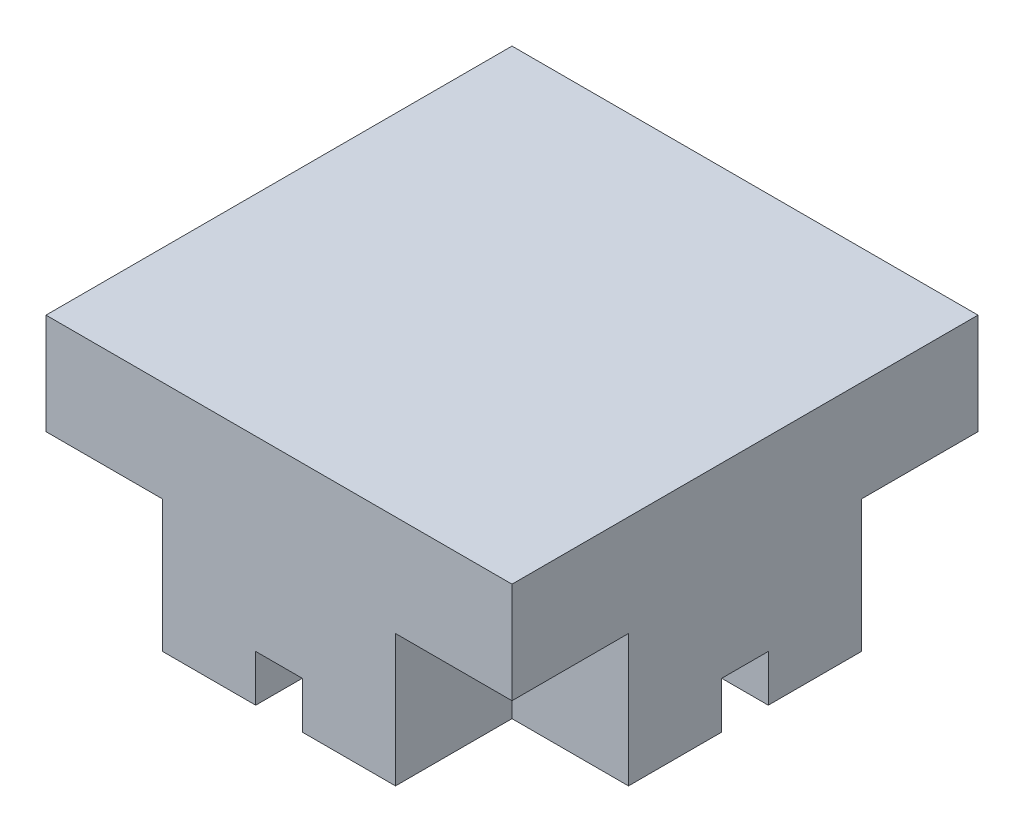
ISO-10303-21;
HEADER;
FILE_DESCRIPTION(('STEP AP214'),'2;1');
FILE_NAME('part.step','',(''),(''),'','','');
FILE_SCHEMA(('AUTOMOTIVE_DESIGN { 1 0 10303 214 1 1 1 1 }'));
ENDSEC;
DATA;
#1=APPLICATION_CONTEXT('core data for automotive mechanical design processes');
#2=APPLICATION_PROTOCOL_DEFINITION('international standard','automotive_design',2000,#1);
#3=PRODUCT_CONTEXT('',#1,'mechanical');
#4=PRODUCT('Part','Part','',(#3));
#5=PRODUCT_RELATED_PRODUCT_CATEGORY('part','',(#4));
#6=PRODUCT_DEFINITION_FORMATION('','',#4);
#7=PRODUCT_DEFINITION_CONTEXT('part definition',#1,'design');
#8=PRODUCT_DEFINITION('design','',#6,#7);
#9=PRODUCT_DEFINITION_SHAPE('','',#8);
#10=(LENGTH_UNIT() NAMED_UNIT(*) SI_UNIT(.MILLI.,.METRE.));
#11=(NAMED_UNIT(*) PLANE_ANGLE_UNIT() SI_UNIT($,.RADIAN.));
#12=(NAMED_UNIT(*) SI_UNIT($,.STERADIAN.) SOLID_ANGLE_UNIT());
#13=UNCERTAINTY_MEASURE_WITH_UNIT(LENGTH_MEASURE(1.E-05),#10,'distance_accuracy_value','');
#14=(GEOMETRIC_REPRESENTATION_CONTEXT(3) GLOBAL_UNCERTAINTY_ASSIGNED_CONTEXT((#13)) GLOBAL_UNIT_ASSIGNED_CONTEXT((#10,
#11,#12)) REPRESENTATION_CONTEXT('',''));
#15=CARTESIAN_POINT('',(0.,0.,0.));
#16=DIRECTION('',(0.,0.,1.));
#17=DIRECTION('',(1.,0.,0.));
#18=AXIS2_PLACEMENT_3D('',#15,#16,#17);
#19=CARTESIAN_POINT('',(1500.,1500.,1500.));
#20=DIRECTION('',(-1.,0.,0.));
#21=DIRECTION('',(0.,0.,1.));
#22=AXIS2_PLACEMENT_3D('',#19,#20,#21);
#23=PLANE('',#22);
#24=DIRECTION('',(0.,0.,1.));
#25=VECTOR('',#24,1.);
#26=CARTESIAN_POINT('',(1500.,300.,150.));
#27=LINE('',#26,#25);
#28=CARTESIAN_POINT('',(1500.,300.,-150.));
#29=VERTEX_POINT('',#28);
#30=CARTESIAN_POINT('',(1500.,300.,150.));
#31=VERTEX_POINT('',#30);
#32=EDGE_CURVE('E316',#29,#31,#27,.T.);
#33=ORIENTED_EDGE('',*,*,#32,.F.);
#34=DIRECTION('',(0.,-1.,0.));
#35=VECTOR('',#34,1.);
#36=CARTESIAN_POINT('',(1500.,300.,-150.));
#37=LINE('',#36,#35);
#38=CARTESIAN_POINT('',(1500.,0.,-150.));
#39=VERTEX_POINT('',#38);
#40=EDGE_CURVE('E334',#29,#39,#37,.T.);
#41=ORIENTED_EDGE('',*,*,#40,.T.);
#42=DIRECTION('',(0.,0.,-1.));
#43=VECTOR('',#42,1.);
#44=CARTESIAN_POINT('',(1500.,0.,1500.));
#45=LINE('',#44,#43);
#46=CARTESIAN_POINT('',(1500.,0.,-750.));
#47=VERTEX_POINT('',#46);
#48=EDGE_CURVE('E411',#39,#47,#45,.T.);
#49=ORIENTED_EDGE('',*,*,#48,.T.);
#50=DIRECTION('',(0.,-1.,0.));
#51=VECTOR('',#50,1.);
#52=CARTESIAN_POINT('',(1500.,850.,-750.));
#53=LINE('',#52,#51);
#54=CARTESIAN_POINT('',(1500.,850.,-750.));
#55=VERTEX_POINT('',#54);
#56=EDGE_CURVE('E661',#55,#47,#53,.T.);
#57=ORIENTED_EDGE('',*,*,#56,.F.);
#58=DIRECTION('',(0.,0.,1.));
#59=VECTOR('',#58,1.);
#60=CARTESIAN_POINT('',(1500.,850.,-1500.));
#61=LINE('',#60,#59);
#62=CARTESIAN_POINT('',(1500.,850.,-1500.));
#63=VERTEX_POINT('',#62);
#64=EDGE_CURVE('E750',#63,#55,#61,.T.);
#65=ORIENTED_EDGE('',*,*,#64,.F.);
#66=DIRECTION('',(0.,-1.,0.));
#67=VECTOR('',#66,1.);
#68=CARTESIAN_POINT('',(1500.,1500.,-1500.));
#69=LINE('',#68,#67);
#70=CARTESIAN_POINT('',(1500.,1500.,-1500.));
#71=VERTEX_POINT('',#70);
#72=EDGE_CURVE('E12',#71,#63,#69,.T.);
#73=ORIENTED_EDGE('',*,*,#72,.F.);
#74=DIRECTION('',(0.,0.,-1.));
#75=VECTOR('',#74,1.);
#76=CARTESIAN_POINT('',(1500.,1500.,1500.));
#77=LINE('',#76,#75);
#78=CARTESIAN_POINT('',(1500.,1500.,1500.));
#79=VERTEX_POINT('',#78);
#80=EDGE_CURVE('E482',#79,#71,#77,.T.);
#81=ORIENTED_EDGE('',*,*,#80,.F.);
#82=DIRECTION('',(0.,-1.,0.));
#83=VECTOR('',#82,1.);
#84=CARTESIAN_POINT('',(1500.,1500.,1500.));
#85=LINE('',#84,#83);
#86=CARTESIAN_POINT('',(1500.,850.,1500.));
#87=VERTEX_POINT('',#86);
#88=EDGE_CURVE('E469',#79,#87,#85,.T.);
#89=ORIENTED_EDGE('',*,*,#88,.T.);
#90=DIRECTION('',(0.,0.,1.));
#91=VECTOR('',#90,1.);
#92=CARTESIAN_POINT('',(1500.,850.,1500.));
#93=LINE('',#92,#91);
#94=CARTESIAN_POINT('',(1500.,850.,750.));
#95=VERTEX_POINT('',#94);
#96=EDGE_CURVE('E384',#95,#87,#93,.T.);
#97=ORIENTED_EDGE('',*,*,#96,.F.);
#98=DIRECTION('',(0.,-1.,0.));
#99=VECTOR('',#98,1.);
#100=CARTESIAN_POINT('',(1500.,850.,750.));
#101=LINE('',#100,#99);
#102=CARTESIAN_POINT('',(1500.,0.,750.));
#103=VERTEX_POINT('',#102);
#104=EDGE_CURVE('E388',#95,#103,#101,.T.);
#105=ORIENTED_EDGE('',*,*,#104,.T.);
#106=CARTESIAN_POINT('',(1500.,0.,150.));
#107=VERTEX_POINT('',#106);
#108=EDGE_CURVE('E404',#103,#107,#45,.T.);
#109=ORIENTED_EDGE('',*,*,#108,.T.);
#110=DIRECTION('',(0.,-1.,0.));
#111=VECTOR('',#110,1.);
#112=CARTESIAN_POINT('',(1500.,300.,150.));
#113=LINE('',#112,#111);
#114=EDGE_CURVE('E364',#31,#107,#113,.T.);
#115=ORIENTED_EDGE('',*,*,#114,.F.);
#116=EDGE_LOOP('',(#33,#41,#49,#57,#65,#73,#81,#89,#97,#105,#109,#115));
#117=FACE_BOUND('',#116,.T.);
#118=ADVANCED_FACE('F41',(#117),#23,.F.);
#119=CARTESIAN_POINT('',(-1500.,1500.,-1500.));
#120=DIRECTION('',(0.,0.,1.));
#121=DIRECTION('',(1.,0.,0.));
#122=AXIS2_PLACEMENT_3D('',#119,#120,#121);
#123=PLANE('',#122);
#124=DIRECTION('',(-1.,0.,0.));
#125=VECTOR('',#124,1.);
#126=CARTESIAN_POINT('',(-1500.,0.,-1500.));
#127=LINE('',#126,#125);
#128=CARTESIAN_POINT('',(750.,0.,-1500.));
#129=VERTEX_POINT('',#128);
#130=CARTESIAN_POINT('',(150.,0.,-1500.));
#131=VERTEX_POINT('',#130);
#132=EDGE_CURVE('E415',#129,#131,#127,.T.);
#133=ORIENTED_EDGE('',*,*,#132,.T.);
#134=DIRECTION('',(0.,-1.,0.));
#135=VECTOR('',#134,1.);
#136=CARTESIAN_POINT('',(150.,300.,-1500.));
#137=LINE('',#136,#135);
#138=CARTESIAN_POINT('',(150.,300.,-1500.));
#139=VERTEX_POINT('',#138);
#140=EDGE_CURVE('E370',#139,#131,#137,.T.);
#141=ORIENTED_EDGE('',*,*,#140,.F.);
#142=DIRECTION('',(1.,0.,0.));
#143=VECTOR('',#142,1.);
#144=CARTESIAN_POINT('',(150.,300.,-1500.));
#145=LINE('',#144,#143);
#146=CARTESIAN_POINT('',(-150.,300.,-1500.));
#147=VERTEX_POINT('',#146);
#148=EDGE_CURVE('E681',#147,#139,#145,.T.);
#149=ORIENTED_EDGE('',*,*,#148,.F.);
#150=DIRECTION('',(0.,-1.,0.));
#151=VECTOR('',#150,1.);
#152=CARTESIAN_POINT('',(-150.,300.,-1500.));
#153=LINE('',#152,#151);
#154=CARTESIAN_POINT('',(-150.,0.,-1500.));
#155=VERTEX_POINT('',#154);
#156=EDGE_CURVE('E807',#147,#155,#153,.T.);
#157=ORIENTED_EDGE('',*,*,#156,.T.);
#158=CARTESIAN_POINT('',(-750.,0.,-1500.));
#159=VERTEX_POINT('',#158);
#160=EDGE_CURVE('E410',#155,#159,#127,.T.);
#161=ORIENTED_EDGE('',*,*,#160,.T.);
#162=DIRECTION('',(0.,-1.,0.));
#163=VECTOR('',#162,1.);
#164=CARTESIAN_POINT('',(-750.,850.,-1500.));
#165=LINE('',#164,#163);
#166=CARTESIAN_POINT('',(-750.,850.,-1500.));
#167=VERTEX_POINT('',#166);
#168=EDGE_CURVE('E437',#167,#159,#165,.T.);
#169=ORIENTED_EDGE('',*,*,#168,.F.);
#170=DIRECTION('',(1.,0.,0.));
#171=VECTOR('',#170,1.);
#172=CARTESIAN_POINT('',(-1500.,850.,-1500.));
#173=LINE('',#172,#171);
#174=CARTESIAN_POINT('',(-1500.,850.,-1500.));
#175=VERTEX_POINT('',#174);
#176=EDGE_CURVE('E715',#175,#167,#173,.T.);
#177=ORIENTED_EDGE('',*,*,#176,.F.);
#178=DIRECTION('',(0.,-1.,0.));
#179=VECTOR('',#178,1.);
#180=CARTESIAN_POINT('',(-1500.,1500.,-1500.));
#181=LINE('',#180,#179);
#182=CARTESIAN_POINT('',(-1500.,1500.,-1500.));
#183=VERTEX_POINT('',#182);
#184=EDGE_CURVE('E50',#183,#175,#181,.T.);
#185=ORIENTED_EDGE('',*,*,#184,.F.);
#186=DIRECTION('',(-1.,0.,0.));
#187=VECTOR('',#186,1.);
#188=CARTESIAN_POINT('',(-1500.,1500.,-1500.));
#189=LINE('',#188,#187);
#190=EDGE_CURVE('E477',#71,#183,#189,.T.);
#191=ORIENTED_EDGE('',*,*,#190,.F.);
#192=ORIENTED_EDGE('',*,*,#72,.T.);
#193=DIRECTION('',(1.,0.,0.));
#194=VECTOR('',#193,1.);
#195=CARTESIAN_POINT('',(1500.,850.,-1500.));
#196=LINE('',#195,#194);
#197=CARTESIAN_POINT('',(750.,850.,-1500.));
#198=VERTEX_POINT('',#197);
#199=EDGE_CURVE('E654',#198,#63,#196,.T.);
#200=ORIENTED_EDGE('',*,*,#199,.F.);
#201=DIRECTION('',(0.,-1.,0.));
#202=VECTOR('',#201,1.);
#203=CARTESIAN_POINT('',(750.,850.,-1500.));
#204=LINE('',#203,#202);
#205=EDGE_CURVE('E759',#198,#129,#204,.T.);
#206=ORIENTED_EDGE('',*,*,#205,.T.);
#207=EDGE_LOOP('',(#133,#141,#149,#157,#161,#169,#177,#185,#191,#192,#200,#206));
#208=FACE_BOUND('',#207,.T.);
#209=ADVANCED_FACE('F736',(#208),#123,.F.);
#210=CARTESIAN_POINT('',(-1500.,1500.,1500.));
#211=DIRECTION('',(1.,0.,0.));
#212=DIRECTION('',(0.,0.,-1.));
#213=AXIS2_PLACEMENT_3D('',#210,#211,#212);
#214=PLANE('',#213);
#215=DIRECTION('',(0.,0.,-1.));
#216=VECTOR('',#215,1.);
#217=CARTESIAN_POINT('',(-1500.,300.,150.));
#218=LINE('',#217,#216);
#219=CARTESIAN_POINT('',(-1500.,300.,150.));
#220=VERTEX_POINT('',#219);
#221=CARTESIAN_POINT('',(-1500.,300.,-150.));
#222=VERTEX_POINT('',#221);
#223=EDGE_CURVE('E552',#220,#222,#218,.T.);
#224=ORIENTED_EDGE('',*,*,#223,.F.);
#225=DIRECTION('',(0.,-1.,0.));
#226=VECTOR('',#225,1.);
#227=CARTESIAN_POINT('',(-1500.,300.,150.));
#228=LINE('',#227,#226);
#229=CARTESIAN_POINT('',(-1500.,0.,150.));
#230=VERTEX_POINT('',#229);
#231=EDGE_CURVE('E556',#220,#230,#228,.T.);
#232=ORIENTED_EDGE('',*,*,#231,.T.);
#233=DIRECTION('',(0.,0.,1.));
#234=VECTOR('',#233,1.);
#235=CARTESIAN_POINT('',(-1500.,0.,1500.));
#236=LINE('',#235,#234);
#237=CARTESIAN_POINT('',(-1500.,0.,750.));
#238=VERTEX_POINT('',#237);
#239=EDGE_CURVE('E421',#230,#238,#236,.T.);
#240=ORIENTED_EDGE('',*,*,#239,.T.);
#241=DIRECTION('',(0.,-1.,0.));
#242=VECTOR('',#241,1.);
#243=CARTESIAN_POINT('',(-1500.,850.,750.));
#244=LINE('',#243,#242);
#245=CARTESIAN_POINT('',(-1500.,850.,750.));
#246=VERTEX_POINT('',#245);
#247=EDGE_CURVE('E533',#246,#238,#244,.T.);
#248=ORIENTED_EDGE('',*,*,#247,.F.);
#249=DIRECTION('',(0.,0.,-1.));
#250=VECTOR('',#249,1.);
#251=CARTESIAN_POINT('',(-1500.,850.,1500.));
#252=LINE('',#251,#250);
#253=CARTESIAN_POINT('',(-1500.,850.,1500.));
#254=VERTEX_POINT('',#253);
#255=EDGE_CURVE('E447',#254,#246,#252,.T.);
#256=ORIENTED_EDGE('',*,*,#255,.F.);
#257=DIRECTION('',(0.,-1.,0.));
#258=VECTOR('',#257,1.);
#259=CARTESIAN_POINT('',(-1500.,1500.,1500.));
#260=LINE('',#259,#258);
#261=CARTESIAN_POINT('',(-1500.,1500.,1500.));
#262=VERTEX_POINT('',#261);
#263=EDGE_CURVE('E464',#262,#254,#260,.T.);
#264=ORIENTED_EDGE('',*,*,#263,.F.);
#265=DIRECTION('',(0.,0.,1.));
#266=VECTOR('',#265,1.);
#267=CARTESIAN_POINT('',(-1500.,1500.,1500.));
#268=LINE('',#267,#266);
#269=EDGE_CURVE('E481',#183,#262,#268,.T.);
#270=ORIENTED_EDGE('',*,*,#269,.F.);
#271=ORIENTED_EDGE('',*,*,#184,.T.);
#272=DIRECTION('',(0.,0.,-1.));
#273=VECTOR('',#272,1.);
#274=CARTESIAN_POINT('',(-1500.,850.,-1500.));
#275=LINE('',#274,#273);
#276=CARTESIAN_POINT('',(-1500.,850.,-750.));
#277=VERTEX_POINT('',#276);
#278=EDGE_CURVE('E708',#277,#175,#275,.T.);
#279=ORIENTED_EDGE('',*,*,#278,.F.);
#280=DIRECTION('',(0.,-1.,0.));
#281=VECTOR('',#280,1.);
#282=CARTESIAN_POINT('',(-1500.,850.,-750.));
#283=LINE('',#282,#281);
#284=CARTESIAN_POINT('',(-1500.,0.,-750.));
#285=VERTEX_POINT('',#284);
#286=EDGE_CURVE('E668',#277,#285,#283,.T.);
#287=ORIENTED_EDGE('',*,*,#286,.T.);
#288=CARTESIAN_POINT('',(-1500.,0.,-150.));
#289=VERTEX_POINT('',#288);
#290=EDGE_CURVE('E422',#285,#289,#236,.T.);
#291=ORIENTED_EDGE('',*,*,#290,.T.);
#292=DIRECTION('',(0.,-1.,0.));
#293=VECTOR('',#292,1.);
#294=CARTESIAN_POINT('',(-1500.,300.,-150.));
#295=LINE('',#294,#293);
#296=EDGE_CURVE('E591',#222,#289,#295,.T.);
#297=ORIENTED_EDGE('',*,*,#296,.F.);
#298=EDGE_LOOP('',(#224,#232,#240,#248,#256,#264,#270,#271,#279,#287,#291,#297));
#299=FACE_BOUND('',#298,.T.);
#300=ADVANCED_FACE('F618',(#299),#214,.F.);
#301=CARTESIAN_POINT('',(-1500.,1500.,1500.));
#302=DIRECTION('',(0.,0.,-1.));
#303=DIRECTION('',(-1.,0.,0.));
#304=AXIS2_PLACEMENT_3D('',#301,#302,#303);
#305=PLANE('',#304);
#306=DIRECTION('',(1.,0.,0.));
#307=VECTOR('',#306,1.);
#308=CARTESIAN_POINT('',(-1500.,0.,1500.));
#309=LINE('',#308,#307);
#310=CARTESIAN_POINT('',(-750.,0.,1500.));
#311=VERTEX_POINT('',#310);
#312=CARTESIAN_POINT('',(-150.,0.,1500.));
#313=VERTEX_POINT('',#312);
#314=EDGE_CURVE('E597',#311,#313,#309,.T.);
#315=ORIENTED_EDGE('',*,*,#314,.T.);
#316=DIRECTION('',(0.,-1.,0.));
#317=VECTOR('',#316,1.);
#318=CARTESIAN_POINT('',(-150.,300.,1500.));
#319=LINE('',#318,#317);
#320=CARTESIAN_POINT('',(-150.,300.,1500.));
#321=VERTEX_POINT('',#320);
#322=EDGE_CURVE('E310',#321,#313,#319,.T.);
#323=ORIENTED_EDGE('',*,*,#322,.F.);
#324=DIRECTION('',(-1.,0.,0.));
#325=VECTOR('',#324,1.);
#326=CARTESIAN_POINT('',(-150.,300.,1500.));
#327=LINE('',#326,#325);
#328=CARTESIAN_POINT('',(150.,300.,1500.));
#329=VERTEX_POINT('',#328);
#330=EDGE_CURVE('E259',#329,#321,#327,.T.);
#331=ORIENTED_EDGE('',*,*,#330,.F.);
#332=DIRECTION('',(0.,-1.,0.));
#333=VECTOR('',#332,1.);
#334=CARTESIAN_POINT('',(150.,300.,1500.));
#335=LINE('',#334,#333);
#336=CARTESIAN_POINT('',(150.,0.,1500.));
#337=VERTEX_POINT('',#336);
#338=EDGE_CURVE('E306',#329,#337,#335,.T.);
#339=ORIENTED_EDGE('',*,*,#338,.T.);
#340=CARTESIAN_POINT('',(750.,0.,1500.));
#341=VERTEX_POINT('',#340);
#342=EDGE_CURVE('E600',#337,#341,#309,.T.);
#343=ORIENTED_EDGE('',*,*,#342,.T.);
#344=DIRECTION('',(0.,-1.,0.));
#345=VECTOR('',#344,1.);
#346=CARTESIAN_POINT('',(750.,850.,1500.));
#347=LINE('',#346,#345);
#348=CARTESIAN_POINT('',(750.,850.,1500.));
#349=VERTEX_POINT('',#348);
#350=EDGE_CURVE('E508',#349,#341,#347,.T.);
#351=ORIENTED_EDGE('',*,*,#350,.F.);
#352=DIRECTION('',(-1.,0.,0.));
#353=VECTOR('',#352,1.);
#354=CARTESIAN_POINT('',(1500.,850.,1500.));
#355=LINE('',#354,#353);
#356=EDGE_CURVE('E506',#87,#349,#355,.T.);
#357=ORIENTED_EDGE('',*,*,#356,.F.);
#358=ORIENTED_EDGE('',*,*,#88,.F.);
#359=DIRECTION('',(1.,0.,0.));
#360=VECTOR('',#359,1.);
#361=CARTESIAN_POINT('',(-1500.,1500.,1500.));
#362=LINE('',#361,#360);
#363=EDGE_CURVE('E412',#262,#79,#362,.T.);
#364=ORIENTED_EDGE('',*,*,#363,.F.);
#365=ORIENTED_EDGE('',*,*,#263,.T.);
#366=DIRECTION('',(-1.,0.,0.));
#367=VECTOR('',#366,1.);
#368=CARTESIAN_POINT('',(-1500.,850.,1500.));
#369=LINE('',#368,#367);
#370=CARTESIAN_POINT('',(-750.,850.,1500.));
#371=VERTEX_POINT('',#370);
#372=EDGE_CURVE('E529',#371,#254,#369,.T.);
#373=ORIENTED_EDGE('',*,*,#372,.F.);
#374=DIRECTION('',(0.,-1.,0.));
#375=VECTOR('',#374,1.);
#376=CARTESIAN_POINT('',(-750.,850.,1500.));
#377=LINE('',#376,#375);
#378=EDGE_CURVE('E832',#371,#311,#377,.T.);
#379=ORIENTED_EDGE('',*,*,#378,.T.);
#380=EDGE_LOOP('',(#315,#323,#331,#339,#343,#351,#357,#358,#364,#365,#373,#379));
#381=FACE_BOUND('',#380,.T.);
#382=ADVANCED_FACE('F503',(#381),#305,.F.);
#383=CARTESIAN_POINT('',(0.,1500.,0.));
#384=DIRECTION('',(0.,-1.,0.));
#385=DIRECTION('',(0.,0.,-1.));
#386=AXIS2_PLACEMENT_3D('',#383,#384,#385);
#387=PLANE('',#386);
#388=ORIENTED_EDGE('',*,*,#80,.T.);
#389=ORIENTED_EDGE('',*,*,#190,.T.);
#390=ORIENTED_EDGE('',*,*,#269,.T.);
#391=ORIENTED_EDGE('',*,*,#363,.T.);
#392=EDGE_LOOP('',(#388,#389,#390,#391));
#393=FACE_BOUND('',#392,.T.);
#394=ADVANCED_FACE('F871',(#393),#387,.F.);
#395=CARTESIAN_POINT('',(0.,0.,0.));
#396=DIRECTION('',(0.,-1.,0.));
#397=DIRECTION('',(0.,0.,-1.));
#398=AXIS2_PLACEMENT_3D('',#395,#396,#397);
#399=PLANE('',#398);
#400=DIRECTION('',(0.,0.,-1.));
#401=VECTOR('',#400,1.);
#402=CARTESIAN_POINT('',(-150.,0.,1500.));
#403=LINE('',#402,#401);
#404=CARTESIAN_POINT('',(-150.,0.,1200.));
#405=VERTEX_POINT('',#404);
#406=EDGE_CURVE('E57',#313,#405,#403,.T.);
#407=ORIENTED_EDGE('',*,*,#406,.F.);
#408=ORIENTED_EDGE('',*,*,#314,.F.);
#409=DIRECTION('',(0.,0.,1.));
#410=VECTOR('',#409,1.);
#411=CARTESIAN_POINT('',(-750.,0.,1500.));
#412=LINE('',#411,#410);
#413=CARTESIAN_POINT('',(-750.,0.,750.));
#414=VERTEX_POINT('',#413);
#415=EDGE_CURVE('E453',#414,#311,#412,.T.);
#416=ORIENTED_EDGE('',*,*,#415,.F.);
#417=DIRECTION('',(1.,0.,0.));
#418=VECTOR('',#417,1.);
#419=CARTESIAN_POINT('',(-1500.,0.,750.));
#420=LINE('',#419,#418);
#421=EDGE_CURVE('E393',#238,#414,#420,.T.);
#422=ORIENTED_EDGE('',*,*,#421,.F.);
#423=ORIENTED_EDGE('',*,*,#239,.F.);
#424=DIRECTION('',(-1.,0.,0.));
#425=VECTOR('',#424,1.);
#426=CARTESIAN_POINT('',(-1500.,0.,150.));
#427=LINE('',#426,#425);
#428=CARTESIAN_POINT('',(-1200.,0.,150.));
#429=VERTEX_POINT('',#428);
#430=EDGE_CURVE('E548',#429,#230,#427,.T.);
#431=ORIENTED_EDGE('',*,*,#430,.F.);
#432=DIRECTION('',(0.,0.,1.));
#433=VECTOR('',#432,1.);
#434=CARTESIAN_POINT('',(-1200.,0.,150.));
#435=LINE('',#434,#433);
#436=CARTESIAN_POINT('',(-1200.,0.,-150.));
#437=VERTEX_POINT('',#436);
#438=EDGE_CURVE('E553',#437,#429,#435,.T.);
#439=ORIENTED_EDGE('',*,*,#438,.F.);
#440=DIRECTION('',(1.,0.,0.));
#441=VECTOR('',#440,1.);
#442=CARTESIAN_POINT('',(-1500.,0.,-150.));
#443=LINE('',#442,#441);
#444=EDGE_CURVE('E1150',#289,#437,#443,.T.);
#445=ORIENTED_EDGE('',*,*,#444,.F.);
#446=ORIENTED_EDGE('',*,*,#290,.F.);
#447=DIRECTION('',(-1.,0.,0.));
#448=VECTOR('',#447,1.);
#449=CARTESIAN_POINT('',(-1500.,0.,-750.));
#450=LINE('',#449,#448);
#451=CARTESIAN_POINT('',(-750.,0.,-750.));
#452=VERTEX_POINT('',#451);
#453=EDGE_CURVE('E703',#452,#285,#450,.T.);
#454=ORIENTED_EDGE('',*,*,#453,.F.);
#455=DIRECTION('',(0.,0.,1.));
#456=VECTOR('',#455,1.);
#457=CARTESIAN_POINT('',(-750.,0.,-1500.));
#458=LINE('',#457,#456);
#459=EDGE_CURVE('E698',#159,#452,#458,.T.);
#460=ORIENTED_EDGE('',*,*,#459,.F.);
#461=ORIENTED_EDGE('',*,*,#160,.F.);
#462=DIRECTION('',(0.,0.,-1.));
#463=VECTOR('',#462,1.);
#464=CARTESIAN_POINT('',(-150.,0.,-1500.));
#465=LINE('',#464,#463);
#466=CARTESIAN_POINT('',(-150.,0.,-1200.));
#467=VERTEX_POINT('',#466);
#468=EDGE_CURVE('E688',#467,#155,#465,.T.);
#469=ORIENTED_EDGE('',*,*,#468,.F.);
#470=DIRECTION('',(-1.,0.,0.));
#471=VECTOR('',#470,1.);
#472=CARTESIAN_POINT('',(150.,0.,-1200.));
#473=LINE('',#472,#471);
#474=CARTESIAN_POINT('',(150.,0.,-1200.));
#475=VERTEX_POINT('',#474);
#476=EDGE_CURVE('E680',#475,#467,#473,.T.);
#477=ORIENTED_EDGE('',*,*,#476,.F.);
#478=DIRECTION('',(0.,0.,1.));
#479=VECTOR('',#478,1.);
#480=CARTESIAN_POINT('',(150.,0.,-1500.));
#481=LINE('',#480,#479);
#482=EDGE_CURVE('E65',#131,#475,#481,.T.);
#483=ORIENTED_EDGE('',*,*,#482,.F.);
#484=ORIENTED_EDGE('',*,*,#132,.F.);
#485=DIRECTION('',(0.,0.,-1.));
#486=VECTOR('',#485,1.);
#487=CARTESIAN_POINT('',(750.,0.,-1500.));
#488=LINE('',#487,#486);
#489=CARTESIAN_POINT('',(750.,0.,-750.));
#490=VERTEX_POINT('',#489);
#491=EDGE_CURVE('E667',#490,#129,#488,.T.);
#492=ORIENTED_EDGE('',*,*,#491,.F.);
#493=DIRECTION('',(-1.,0.,0.));
#494=VECTOR('',#493,1.);
#495=CARTESIAN_POINT('',(1500.,0.,-750.));
#496=LINE('',#495,#494);
#497=EDGE_CURVE('E662',#47,#490,#496,.T.);
#498=ORIENTED_EDGE('',*,*,#497,.F.);
#499=ORIENTED_EDGE('',*,*,#48,.F.);
#500=DIRECTION('',(1.,0.,0.));
#501=VECTOR('',#500,1.);
#502=CARTESIAN_POINT('',(1500.,0.,-150.));
#503=LINE('',#502,#501);
#504=CARTESIAN_POINT('',(1200.,0.,-150.));
#505=VERTEX_POINT('',#504);
#506=EDGE_CURVE('E322',#505,#39,#503,.T.);
#507=ORIENTED_EDGE('',*,*,#506,.F.);
#508=DIRECTION('',(0.,0.,-1.));
#509=VECTOR('',#508,1.);
#510=CARTESIAN_POINT('',(1200.,0.,150.));
#511=LINE('',#510,#509);
#512=CARTESIAN_POINT('',(1200.,0.,150.));
#513=VERTEX_POINT('',#512);
#514=EDGE_CURVE('E369',#513,#505,#511,.T.);
#515=ORIENTED_EDGE('',*,*,#514,.F.);
#516=DIRECTION('',(-1.,0.,0.));
#517=VECTOR('',#516,1.);
#518=CARTESIAN_POINT('',(1500.,0.,150.));
#519=LINE('',#518,#517);
#520=EDGE_CURVE('E365',#107,#513,#519,.T.);
#521=ORIENTED_EDGE('',*,*,#520,.F.);
#522=ORIENTED_EDGE('',*,*,#108,.F.);
#523=DIRECTION('',(1.,0.,0.));
#524=VECTOR('',#523,1.);
#525=CARTESIAN_POINT('',(1500.,0.,750.));
#526=LINE('',#525,#524);
#527=CARTESIAN_POINT('',(750.,0.,750.));
#528=VERTEX_POINT('',#527);
#529=EDGE_CURVE('E380',#528,#103,#526,.T.);
#530=ORIENTED_EDGE('',*,*,#529,.F.);
#531=DIRECTION('',(0.,0.,-1.));
#532=VECTOR('',#531,1.);
#533=CARTESIAN_POINT('',(750.,0.,1500.));
#534=LINE('',#533,#532);
#535=EDGE_CURVE('E385',#341,#528,#534,.T.);
#536=ORIENTED_EDGE('',*,*,#535,.F.);
#537=ORIENTED_EDGE('',*,*,#342,.F.);
#538=DIRECTION('',(0.,0.,1.));
#539=VECTOR('',#538,1.);
#540=CARTESIAN_POINT('',(150.,0.,1500.));
#541=LINE('',#540,#539);
#542=CARTESIAN_POINT('',(150.,0.,1200.));
#543=VERTEX_POINT('',#542);
#544=EDGE_CURVE('E274',#543,#337,#541,.T.);
#545=ORIENTED_EDGE('',*,*,#544,.F.);
#546=DIRECTION('',(1.,0.,0.));
#547=VECTOR('',#546,1.);
#548=CARTESIAN_POINT('',(-150.,0.,1200.));
#549=LINE('',#548,#547);
#550=EDGE_CURVE('E277',#405,#543,#549,.T.);
#551=ORIENTED_EDGE('',*,*,#550,.F.);
#552=EDGE_LOOP('',(#407,#408,#416,#422,#423,#431,#439,#445,#446,#454,#460,#461,#469,#477,#483,
#484,#492,#498,#499,#507,#515,#521,#522,#530,#536,#537,#545,#551));
#553=FACE_BOUND('',#552,.T.);
#554=ADVANCED_FACE('F629',(#553),#399,.T.);
#555=CARTESIAN_POINT('',(-750.,850.,1500.));
#556=DIRECTION('',(1.,0.,0.));
#557=DIRECTION('',(0.,0.,-1.));
#558=AXIS2_PLACEMENT_3D('',#555,#556,#557);
#559=PLANE('',#558);
#560=ORIENTED_EDGE('',*,*,#415,.T.);
#561=ORIENTED_EDGE('',*,*,#378,.F.);
#562=DIRECTION('',(0.,0.,1.));
#563=VECTOR('',#562,1.);
#564=CARTESIAN_POINT('',(-750.,850.,1500.));
#565=LINE('',#564,#563);
#566=CARTESIAN_POINT('',(-750.,850.,750.));
#567=VERTEX_POINT('',#566);
#568=EDGE_CURVE('E534',#567,#371,#565,.T.);
#569=ORIENTED_EDGE('',*,*,#568,.F.);
#570=DIRECTION('',(0.,-1.,0.));
#571=VECTOR('',#570,1.);
#572=CARTESIAN_POINT('',(-750.,850.,750.));
#573=LINE('',#572,#571);
#574=EDGE_CURVE('E628',#567,#414,#573,.T.);
#575=ORIENTED_EDGE('',*,*,#574,.T.);
#576=EDGE_LOOP('',(#560,#561,#569,#575));
#577=FACE_BOUND('',#576,.T.);
#578=ADVANCED_FACE('F874',(#577),#559,.F.);
#579=CARTESIAN_POINT('',(-1500.,850.,750.));
#580=DIRECTION('',(0.,0.,-1.));
#581=DIRECTION('',(-1.,0.,0.));
#582=AXIS2_PLACEMENT_3D('',#579,#580,#581);
#583=PLANE('',#582);
#584=ORIENTED_EDGE('',*,*,#421,.T.);
#585=ORIENTED_EDGE('',*,*,#574,.F.);
#586=DIRECTION('',(1.,0.,0.));
#587=VECTOR('',#586,1.);
#588=CARTESIAN_POINT('',(-1500.,850.,750.));
#589=LINE('',#588,#587);
#590=EDGE_CURVE('E452',#246,#567,#589,.T.);
#591=ORIENTED_EDGE('',*,*,#590,.F.);
#592=ORIENTED_EDGE('',*,*,#247,.T.);
#593=EDGE_LOOP('',(#584,#585,#591,#592));
#594=FACE_BOUND('',#593,.T.);
#595=ADVANCED_FACE('F624',(#594),#583,.F.);
#596=CARTESIAN_POINT('',(0.,850.,0.));
#597=DIRECTION('',(0.,-1.,0.));
#598=DIRECTION('',(0.,0.,-1.));
#599=AXIS2_PLACEMENT_3D('',#596,#597,#598);
#600=PLANE('',#599);
#601=ORIENTED_EDGE('',*,*,#255,.T.);
#602=ORIENTED_EDGE('',*,*,#590,.T.);
#603=ORIENTED_EDGE('',*,*,#568,.T.);
#604=ORIENTED_EDGE('',*,*,#372,.T.);
#605=EDGE_LOOP('',(#601,#602,#603,#604));
#606=FACE_BOUND('',#605,.T.);
#607=ADVANCED_FACE('F879',(#606),#600,.T.);
#608=CARTESIAN_POINT('',(1500.,850.,750.));
#609=DIRECTION('',(0.,0.,-1.));
#610=DIRECTION('',(-1.,0.,0.));
#611=AXIS2_PLACEMENT_3D('',#608,#609,#610);
#612=PLANE('',#611);
#613=ORIENTED_EDGE('',*,*,#529,.T.);
#614=ORIENTED_EDGE('',*,*,#104,.F.);
#615=DIRECTION('',(1.,0.,0.));
#616=VECTOR('',#615,1.);
#617=CARTESIAN_POINT('',(1500.,850.,750.));
#618=LINE('',#617,#616);
#619=CARTESIAN_POINT('',(750.,850.,750.));
#620=VERTEX_POINT('',#619);
#621=EDGE_CURVE('E516',#620,#95,#618,.T.);
#622=ORIENTED_EDGE('',*,*,#621,.F.);
#623=DIRECTION('',(0.,-1.,0.));
#624=VECTOR('',#623,1.);
#625=CARTESIAN_POINT('',(750.,850.,750.));
#626=LINE('',#625,#624);
#627=EDGE_CURVE('E394',#620,#528,#626,.T.);
#628=ORIENTED_EDGE('',*,*,#627,.T.);
#629=EDGE_LOOP('',(#613,#614,#622,#628));
#630=FACE_BOUND('',#629,.T.);
#631=ADVANCED_FACE('F770',(#630),#612,.F.);
#632=CARTESIAN_POINT('',(750.,850.,1500.));
#633=DIRECTION('',(-1.,0.,0.));
#634=DIRECTION('',(0.,0.,1.));
#635=AXIS2_PLACEMENT_3D('',#632,#633,#634);
#636=PLANE('',#635);
#637=ORIENTED_EDGE('',*,*,#535,.T.);
#638=ORIENTED_EDGE('',*,*,#627,.F.);
#639=DIRECTION('',(0.,0.,-1.));
#640=VECTOR('',#639,1.);
#641=CARTESIAN_POINT('',(750.,850.,1500.));
#642=LINE('',#641,#640);
#643=EDGE_CURVE('E512',#349,#620,#642,.T.);
#644=ORIENTED_EDGE('',*,*,#643,.F.);
#645=ORIENTED_EDGE('',*,*,#350,.T.);
#646=EDGE_LOOP('',(#637,#638,#644,#645));
#647=FACE_BOUND('',#646,.T.);
#648=ADVANCED_FACE('F766',(#647),#636,.F.);
#649=CARTESIAN_POINT('',(0.,850.,0.));
#650=DIRECTION('',(0.,1.,0.));
#651=DIRECTION('',(0.,0.,1.));
#652=AXIS2_PLACEMENT_3D('',#649,#650,#651);
#653=PLANE('',#652);
#654=ORIENTED_EDGE('',*,*,#96,.T.);
#655=ORIENTED_EDGE('',*,*,#356,.T.);
#656=ORIENTED_EDGE('',*,*,#643,.T.);
#657=ORIENTED_EDGE('',*,*,#621,.T.);
#658=EDGE_LOOP('',(#654,#655,#656,#657));
#659=FACE_BOUND('',#658,.T.);
#660=ADVANCED_FACE('F896',(#659),#653,.F.);
#661=CARTESIAN_POINT('',(750.,850.,-1500.));
#662=DIRECTION('',(-1.,0.,0.));
#663=DIRECTION('',(0.,0.,1.));
#664=AXIS2_PLACEMENT_3D('',#661,#662,#663);
#665=PLANE('',#664);
#666=ORIENTED_EDGE('',*,*,#491,.T.);
#667=ORIENTED_EDGE('',*,*,#205,.F.);
#668=DIRECTION('',(0.,0.,-1.));
#669=VECTOR('',#668,1.);
#670=CARTESIAN_POINT('',(750.,850.,-1500.));
#671=LINE('',#670,#669);
#672=CARTESIAN_POINT('',(750.,850.,-750.));
#673=VERTEX_POINT('',#672);
#674=EDGE_CURVE('E649',#673,#198,#671,.T.);
#675=ORIENTED_EDGE('',*,*,#674,.F.);
#676=DIRECTION('',(0.,-1.,0.));
#677=VECTOR('',#676,1.);
#678=CARTESIAN_POINT('',(750.,850.,-750.));
#679=LINE('',#678,#677);
#680=EDGE_CURVE('E757',#673,#490,#679,.T.);
#681=ORIENTED_EDGE('',*,*,#680,.T.);
#682=EDGE_LOOP('',(#666,#667,#675,#681));
#683=FACE_BOUND('',#682,.T.);
#684=ADVANCED_FACE('F820',(#683),#665,.F.);
#685=CARTESIAN_POINT('',(1500.,850.,-750.));
#686=DIRECTION('',(0.,0.,1.));
#687=DIRECTION('',(1.,0.,0.));
#688=AXIS2_PLACEMENT_3D('',#685,#686,#687);
#689=PLANE('',#688);
#690=ORIENTED_EDGE('',*,*,#497,.T.);
#691=ORIENTED_EDGE('',*,*,#680,.F.);
#692=DIRECTION('',(-1.,0.,0.));
#693=VECTOR('',#692,1.);
#694=CARTESIAN_POINT('',(1500.,850.,-750.));
#695=LINE('',#694,#693);
#696=EDGE_CURVE('E655',#55,#673,#695,.T.);
#697=ORIENTED_EDGE('',*,*,#696,.F.);
#698=ORIENTED_EDGE('',*,*,#56,.T.);
#699=EDGE_LOOP('',(#690,#691,#697,#698));
#700=FACE_BOUND('',#699,.T.);
#701=ADVANCED_FACE('F826',(#700),#689,.F.);
#702=CARTESIAN_POINT('',(0.,850.,0.));
#703=DIRECTION('',(0.,-1.,0.));
#704=DIRECTION('',(0.,0.,-1.));
#705=AXIS2_PLACEMENT_3D('',#702,#703,#704);
#706=PLANE('',#705);
#707=ORIENTED_EDGE('',*,*,#64,.T.);
#708=ORIENTED_EDGE('',*,*,#696,.T.);
#709=ORIENTED_EDGE('',*,*,#674,.T.);
#710=ORIENTED_EDGE('',*,*,#199,.T.);
#711=EDGE_LOOP('',(#707,#708,#709,#710));
#712=FACE_BOUND('',#711,.T.);
#713=ADVANCED_FACE('F822',(#712),#706,.T.);
#714=CARTESIAN_POINT('',(-1500.,850.,-750.));
#715=DIRECTION('',(0.,0.,1.));
#716=DIRECTION('',(1.,0.,0.));
#717=AXIS2_PLACEMENT_3D('',#714,#715,#716);
#718=PLANE('',#717);
#719=ORIENTED_EDGE('',*,*,#453,.T.);
#720=ORIENTED_EDGE('',*,*,#286,.F.);
#721=DIRECTION('',(-1.,0.,0.));
#722=VECTOR('',#721,1.);
#723=CARTESIAN_POINT('',(-1500.,850.,-750.));
#724=LINE('',#723,#722);
#725=CARTESIAN_POINT('',(-750.,850.,-750.));
#726=VERTEX_POINT('',#725);
#727=EDGE_CURVE('E444',#726,#277,#724,.T.);
#728=ORIENTED_EDGE('',*,*,#727,.F.);
#729=DIRECTION('',(0.,-1.,0.));
#730=VECTOR('',#729,1.);
#731=CARTESIAN_POINT('',(-750.,850.,-750.));
#732=LINE('',#731,#730);
#733=EDGE_CURVE('E443',#726,#452,#732,.T.);
#734=ORIENTED_EDGE('',*,*,#733,.T.);
#735=EDGE_LOOP('',(#719,#720,#728,#734));
#736=FACE_BOUND('',#735,.T.);
#737=ADVANCED_FACE('F746',(#736),#718,.F.);
#738=CARTESIAN_POINT('',(-750.,850.,-1500.));
#739=DIRECTION('',(1.,0.,0.));
#740=DIRECTION('',(0.,0.,-1.));
#741=AXIS2_PLACEMENT_3D('',#738,#739,#740);
#742=PLANE('',#741);
#743=ORIENTED_EDGE('',*,*,#459,.T.);
#744=ORIENTED_EDGE('',*,*,#733,.F.);
#745=DIRECTION('',(0.,0.,1.));
#746=VECTOR('',#745,1.);
#747=CARTESIAN_POINT('',(-750.,850.,-1500.));
#748=LINE('',#747,#746);
#749=EDGE_CURVE('E720',#167,#726,#748,.T.);
#750=ORIENTED_EDGE('',*,*,#749,.F.);
#751=ORIENTED_EDGE('',*,*,#168,.T.);
#752=EDGE_LOOP('',(#743,#744,#750,#751));
#753=FACE_BOUND('',#752,.T.);
#754=ADVANCED_FACE('F742',(#753),#742,.F.);
#755=CARTESIAN_POINT('',(0.,850.,0.));
#756=DIRECTION('',(0.,1.,0.));
#757=DIRECTION('',(0.,0.,1.));
#758=AXIS2_PLACEMENT_3D('',#755,#756,#757);
#759=PLANE('',#758);
#760=ORIENTED_EDGE('',*,*,#278,.T.);
#761=ORIENTED_EDGE('',*,*,#176,.T.);
#762=ORIENTED_EDGE('',*,*,#749,.T.);
#763=ORIENTED_EDGE('',*,*,#727,.T.);
#764=EDGE_LOOP('',(#760,#761,#762,#763));
#765=FACE_BOUND('',#764,.T.);
#766=ADVANCED_FACE('F731',(#765),#759,.F.);
#767=CARTESIAN_POINT('',(-1500.,300.,150.));
#768=DIRECTION('',(0.,0.,1.));
#769=DIRECTION('',(1.,0.,0.));
#770=AXIS2_PLACEMENT_3D('',#767,#768,#769);
#771=PLANE('',#770);
#772=ORIENTED_EDGE('',*,*,#430,.T.);
#773=ORIENTED_EDGE('',*,*,#231,.F.);
#774=DIRECTION('',(-1.,0.,0.));
#775=VECTOR('',#774,1.);
#776=CARTESIAN_POINT('',(-1500.,300.,150.));
#777=LINE('',#776,#775);
#778=CARTESIAN_POINT('',(-1200.,300.,150.));
#779=VERTEX_POINT('',#778);
#780=EDGE_CURVE('E583',#779,#220,#777,.T.);
#781=ORIENTED_EDGE('',*,*,#780,.F.);
#782=DIRECTION('',(0.,-1.,0.));
#783=VECTOR('',#782,1.);
#784=CARTESIAN_POINT('',(-1200.,300.,150.));
#785=LINE('',#784,#783);
#786=EDGE_CURVE('E561',#779,#429,#785,.T.);
#787=ORIENTED_EDGE('',*,*,#786,.T.);
#788=EDGE_LOOP('',(#772,#773,#781,#787));
#789=FACE_BOUND('',#788,.T.);
#790=ADVANCED_FACE('F891',(#789),#771,.F.);
#791=CARTESIAN_POINT('',(-1200.,300.,150.));
#792=DIRECTION('',(1.,0.,0.));
#793=DIRECTION('',(0.,0.,-1.));
#794=AXIS2_PLACEMENT_3D('',#791,#792,#793);
#795=PLANE('',#794);
#796=ORIENTED_EDGE('',*,*,#438,.T.);
#797=ORIENTED_EDGE('',*,*,#786,.F.);
#798=DIRECTION('',(0.,0.,1.));
#799=VECTOR('',#798,1.);
#800=CARTESIAN_POINT('',(-1200.,300.,150.));
#801=LINE('',#800,#799);
#802=CARTESIAN_POINT('',(-1200.,300.,-150.));
#803=VERTEX_POINT('',#802);
#804=EDGE_CURVE('E578',#803,#779,#801,.T.);
#805=ORIENTED_EDGE('',*,*,#804,.F.);
#806=DIRECTION('',(0.,-1.,0.));
#807=VECTOR('',#806,1.);
#808=CARTESIAN_POINT('',(-1200.,300.,-150.));
#809=LINE('',#808,#807);
#810=EDGE_CURVE('E588',#803,#437,#809,.T.);
#811=ORIENTED_EDGE('',*,*,#810,.T.);
#812=EDGE_LOOP('',(#796,#797,#805,#811));
#813=FACE_BOUND('',#812,.T.);
#814=ADVANCED_FACE('F909',(#813),#795,.F.);
#815=CARTESIAN_POINT('',(-1500.,300.,-150.));
#816=DIRECTION('',(0.,0.,-1.));
#817=DIRECTION('',(-1.,0.,0.));
#818=AXIS2_PLACEMENT_3D('',#815,#816,#817);
#819=PLANE('',#818);
#820=ORIENTED_EDGE('',*,*,#444,.T.);
#821=ORIENTED_EDGE('',*,*,#810,.F.);
#822=DIRECTION('',(1.,0.,0.));
#823=VECTOR('',#822,1.);
#824=CARTESIAN_POINT('',(-1500.,300.,-150.));
#825=LINE('',#824,#823);
#826=EDGE_CURVE('E570',#222,#803,#825,.T.);
#827=ORIENTED_EDGE('',*,*,#826,.F.);
#828=ORIENTED_EDGE('',*,*,#296,.T.);
#829=EDGE_LOOP('',(#820,#821,#827,#828));
#830=FACE_BOUND('',#829,.T.);
#831=ADVANCED_FACE('F905',(#830),#819,.F.);
#832=CARTESIAN_POINT('',(0.,300.,0.));
#833=DIRECTION('',(0.,-1.,0.));
#834=DIRECTION('',(0.,0.,-1.));
#835=AXIS2_PLACEMENT_3D('',#832,#833,#834);
#836=PLANE('',#835);
#837=ORIENTED_EDGE('',*,*,#223,.T.);
#838=ORIENTED_EDGE('',*,*,#826,.T.);
#839=ORIENTED_EDGE('',*,*,#804,.T.);
#840=ORIENTED_EDGE('',*,*,#780,.T.);
#841=EDGE_LOOP('',(#837,#838,#839,#840));
#842=FACE_BOUND('',#841,.T.);
#843=ADVANCED_FACE('F908',(#842),#836,.T.);
#844=CARTESIAN_POINT('',(150.,300.,-1500.));
#845=DIRECTION('',(1.,0.,0.));
#846=DIRECTION('',(0.,0.,-1.));
#847=AXIS2_PLACEMENT_3D('',#844,#845,#846);
#848=PLANE('',#847);
#849=ORIENTED_EDGE('',*,*,#482,.T.);
#850=DIRECTION('',(0.,-1.,0.));
#851=VECTOR('',#850,1.);
#852=CARTESIAN_POINT('',(150.,300.,-1200.));
#853=LINE('',#852,#851);
#854=CARTESIAN_POINT('',(150.,300.,-1200.));
#855=VERTEX_POINT('',#854);
#856=EDGE_CURVE('E571',#855,#475,#853,.T.);
#857=ORIENTED_EDGE('',*,*,#856,.F.);
#858=DIRECTION('',(0.,0.,1.));
#859=VECTOR('',#858,1.);
#860=CARTESIAN_POINT('',(150.,300.,-1500.));
#861=LINE('',#860,#859);
#862=EDGE_CURVE('E692',#139,#855,#861,.T.);
#863=ORIENTED_EDGE('',*,*,#862,.F.);
#864=ORIENTED_EDGE('',*,*,#140,.T.);
#865=EDGE_LOOP('',(#849,#857,#863,#864));
#866=FACE_BOUND('',#865,.T.);
#867=ADVANCED_FACE('F814',(#866),#848,.F.);
#868=CARTESIAN_POINT('',(-150.,300.,-1500.));
#869=DIRECTION('',(-1.,0.,0.));
#870=DIRECTION('',(0.,0.,1.));
#871=AXIS2_PLACEMENT_3D('',#868,#869,#870);
#872=PLANE('',#871);
#873=ORIENTED_EDGE('',*,*,#468,.T.);
#874=ORIENTED_EDGE('',*,*,#156,.F.);
#875=DIRECTION('',(0.,0.,-1.));
#876=VECTOR('',#875,1.);
#877=CARTESIAN_POINT('',(-150.,300.,-1500.));
#878=LINE('',#877,#876);
#879=CARTESIAN_POINT('',(-150.,300.,-1200.));
#880=VERTEX_POINT('',#879);
#881=EDGE_CURVE('E788',#880,#147,#878,.T.);
#882=ORIENTED_EDGE('',*,*,#881,.F.);
#883=DIRECTION('',(0.,-1.,0.));
#884=VECTOR('',#883,1.);
#885=CARTESIAN_POINT('',(-150.,300.,-1200.));
#886=LINE('',#885,#884);
#887=EDGE_CURVE('E804',#880,#467,#886,.T.);
#888=ORIENTED_EDGE('',*,*,#887,.T.);
#889=EDGE_LOOP('',(#873,#874,#882,#888));
#890=FACE_BOUND('',#889,.T.);
#891=ADVANCED_FACE('F808',(#890),#872,.F.);
#892=CARTESIAN_POINT('',(150.,300.,-1200.));
#893=DIRECTION('',(0.,0.,1.));
#894=DIRECTION('',(1.,0.,0.));
#895=AXIS2_PLACEMENT_3D('',#892,#893,#894);
#896=PLANE('',#895);
#897=ORIENTED_EDGE('',*,*,#476,.T.);
#898=ORIENTED_EDGE('',*,*,#887,.F.);
#899=DIRECTION('',(-1.,0.,0.));
#900=VECTOR('',#899,1.);
#901=CARTESIAN_POINT('',(150.,300.,-1200.));
#902=LINE('',#901,#900);
#903=EDGE_CURVE('E781',#855,#880,#902,.T.);
#904=ORIENTED_EDGE('',*,*,#903,.F.);
#905=ORIENTED_EDGE('',*,*,#856,.T.);
#906=EDGE_LOOP('',(#897,#898,#904,#905));
#907=FACE_BOUND('',#906,.T.);
#908=ADVANCED_FACE('F802',(#907),#896,.F.);
#909=CARTESIAN_POINT('',(0.,300.,0.));
#910=DIRECTION('',(0.,-1.,0.));
#911=DIRECTION('',(0.,0.,-1.));
#912=AXIS2_PLACEMENT_3D('',#909,#910,#911);
#913=PLANE('',#912);
#914=ORIENTED_EDGE('',*,*,#862,.T.);
#915=ORIENTED_EDGE('',*,*,#903,.T.);
#916=ORIENTED_EDGE('',*,*,#881,.T.);
#917=ORIENTED_EDGE('',*,*,#148,.T.);
#918=EDGE_LOOP('',(#914,#915,#916,#917));
#919=FACE_BOUND('',#918,.T.);
#920=ADVANCED_FACE('F800',(#919),#913,.T.);
#921=CARTESIAN_POINT('',(1500.,300.,-150.));
#922=DIRECTION('',(0.,0.,-1.));
#923=DIRECTION('',(-1.,0.,0.));
#924=AXIS2_PLACEMENT_3D('',#921,#922,#923);
#925=PLANE('',#924);
#926=ORIENTED_EDGE('',*,*,#506,.T.);
#927=ORIENTED_EDGE('',*,*,#40,.F.);
#928=DIRECTION('',(1.,0.,0.));
#929=VECTOR('',#928,1.);
#930=CARTESIAN_POINT('',(1500.,300.,-150.));
#931=LINE('',#930,#929);
#932=CARTESIAN_POINT('',(1200.,300.,-150.));
#933=VERTEX_POINT('',#932);
#934=EDGE_CURVE('E359',#933,#29,#931,.T.);
#935=ORIENTED_EDGE('',*,*,#934,.F.);
#936=DIRECTION('',(0.,-1.,0.));
#937=VECTOR('',#936,1.);
#938=CARTESIAN_POINT('',(1200.,300.,-150.));
#939=LINE('',#938,#937);
#940=EDGE_CURVE('E340',#933,#505,#939,.T.);
#941=ORIENTED_EDGE('',*,*,#940,.T.);
#942=EDGE_LOOP('',(#926,#927,#935,#941));
#943=FACE_BOUND('',#942,.T.);
#944=ADVANCED_FACE('F928',(#943),#925,.F.);
#945=CARTESIAN_POINT('',(1200.,300.,150.));
#946=DIRECTION('',(-1.,0.,0.));
#947=DIRECTION('',(0.,0.,1.));
#948=AXIS2_PLACEMENT_3D('',#945,#946,#947);
#949=PLANE('',#948);
#950=ORIENTED_EDGE('',*,*,#514,.T.);
#951=ORIENTED_EDGE('',*,*,#940,.F.);
#952=DIRECTION('',(0.,0.,-1.));
#953=VECTOR('',#952,1.);
#954=CARTESIAN_POINT('',(1200.,300.,150.));
#955=LINE('',#954,#953);
#956=CARTESIAN_POINT('',(1200.,300.,150.));
#957=VERTEX_POINT('',#956);
#958=EDGE_CURVE('E355',#957,#933,#955,.T.);
#959=ORIENTED_EDGE('',*,*,#958,.F.);
#960=DIRECTION('',(0.,-1.,0.));
#961=VECTOR('',#960,1.);
#962=CARTESIAN_POINT('',(1200.,300.,150.));
#963=LINE('',#962,#961);
#964=EDGE_CURVE('E346',#957,#513,#963,.T.);
#965=ORIENTED_EDGE('',*,*,#964,.T.);
#966=EDGE_LOOP('',(#950,#951,#959,#965));
#967=FACE_BOUND('',#966,.T.);
#968=ADVANCED_FACE('F932',(#967),#949,.F.);
#969=CARTESIAN_POINT('',(1500.,300.,150.));
#970=DIRECTION('',(0.,0.,1.));
#971=DIRECTION('',(1.,0.,0.));
#972=AXIS2_PLACEMENT_3D('',#969,#970,#971);
#973=PLANE('',#972);
#974=ORIENTED_EDGE('',*,*,#520,.T.);
#975=ORIENTED_EDGE('',*,*,#964,.F.);
#976=DIRECTION('',(-1.,0.,0.));
#977=VECTOR('',#976,1.);
#978=CARTESIAN_POINT('',(1500.,300.,150.));
#979=LINE('',#978,#977);
#980=EDGE_CURVE('E321',#31,#957,#979,.T.);
#981=ORIENTED_EDGE('',*,*,#980,.F.);
#982=ORIENTED_EDGE('',*,*,#114,.T.);
#983=EDGE_LOOP('',(#974,#975,#981,#982));
#984=FACE_BOUND('',#983,.T.);
#985=ADVANCED_FACE('F929',(#984),#973,.F.);
#986=CARTESIAN_POINT('',(0.,300.,0.));
#987=DIRECTION('',(0.,1.,0.));
#988=DIRECTION('',(0.,0.,1.));
#989=AXIS2_PLACEMENT_3D('',#986,#987,#988);
#990=PLANE('',#989);
#991=ORIENTED_EDGE('',*,*,#32,.T.);
#992=ORIENTED_EDGE('',*,*,#980,.T.);
#993=ORIENTED_EDGE('',*,*,#958,.T.);
#994=ORIENTED_EDGE('',*,*,#934,.T.);
#995=EDGE_LOOP('',(#991,#992,#993,#994));
#996=FACE_BOUND('',#995,.T.);
#997=ADVANCED_FACE('F857',(#996),#990,.F.);
#998=CARTESIAN_POINT('',(-150.,300.,1500.));
#999=DIRECTION('',(-1.,0.,0.));
#1000=DIRECTION('',(0.,0.,1.));
#1001=AXIS2_PLACEMENT_3D('',#998,#999,#1000);
#1002=PLANE('',#1001);
#1003=ORIENTED_EDGE('',*,*,#406,.T.);
#1004=DIRECTION('',(0.,-1.,0.));
#1005=VECTOR('',#1004,1.);
#1006=CARTESIAN_POINT('',(-150.,300.,1200.));
#1007=LINE('',#1006,#1005);
#1008=CARTESIAN_POINT('',(-150.,300.,1200.));
#1009=VERTEX_POINT('',#1008);
#1010=EDGE_CURVE('E248',#1009,#405,#1007,.T.);
#1011=ORIENTED_EDGE('',*,*,#1010,.F.);
#1012=DIRECTION('',(0.,0.,-1.));
#1013=VECTOR('',#1012,1.);
#1014=CARTESIAN_POINT('',(-150.,300.,1500.));
#1015=LINE('',#1014,#1013);
#1016=EDGE_CURVE('E252',#321,#1009,#1015,.T.);
#1017=ORIENTED_EDGE('',*,*,#1016,.F.);
#1018=ORIENTED_EDGE('',*,*,#322,.T.);
#1019=EDGE_LOOP('',(#1003,#1011,#1017,#1018));
#1020=FACE_BOUND('',#1019,.T.);
#1021=ADVANCED_FACE('F250',(#1020),#1002,.F.);
#1022=CARTESIAN_POINT('',(150.,300.,1500.));
#1023=DIRECTION('',(1.,0.,0.));
#1024=DIRECTION('',(0.,0.,-1.));
#1025=AXIS2_PLACEMENT_3D('',#1022,#1023,#1024);
#1026=PLANE('',#1025);
#1027=ORIENTED_EDGE('',*,*,#544,.T.);
#1028=ORIENTED_EDGE('',*,*,#338,.F.);
#1029=DIRECTION('',(0.,0.,1.));
#1030=VECTOR('',#1029,1.);
#1031=CARTESIAN_POINT('',(150.,300.,1500.));
#1032=LINE('',#1031,#1030);
#1033=CARTESIAN_POINT('',(150.,300.,1200.));
#1034=VERTEX_POINT('',#1033);
#1035=EDGE_CURVE('E268',#1034,#329,#1032,.T.);
#1036=ORIENTED_EDGE('',*,*,#1035,.F.);
#1037=DIRECTION('',(0.,-1.,0.));
#1038=VECTOR('',#1037,1.);
#1039=CARTESIAN_POINT('',(150.,300.,1200.));
#1040=LINE('',#1039,#1038);
#1041=EDGE_CURVE('E258',#1034,#543,#1040,.T.);
#1042=ORIENTED_EDGE('',*,*,#1041,.T.);
#1043=EDGE_LOOP('',(#1027,#1028,#1036,#1042));
#1044=FACE_BOUND('',#1043,.T.);
#1045=ADVANCED_FACE('F848',(#1044),#1026,.F.);
#1046=CARTESIAN_POINT('',(-150.,300.,1200.));
#1047=DIRECTION('',(0.,0.,-1.));
#1048=DIRECTION('',(-1.,0.,0.));
#1049=AXIS2_PLACEMENT_3D('',#1046,#1047,#1048);
#1050=PLANE('',#1049);
#1051=ORIENTED_EDGE('',*,*,#550,.T.);
#1052=ORIENTED_EDGE('',*,*,#1041,.F.);
#1053=DIRECTION('',(1.,0.,0.));
#1054=VECTOR('',#1053,1.);
#1055=CARTESIAN_POINT('',(-150.,300.,1200.));
#1056=LINE('',#1055,#1054);
#1057=EDGE_CURVE('E262',#1009,#1034,#1056,.T.);
#1058=ORIENTED_EDGE('',*,*,#1057,.F.);
#1059=ORIENTED_EDGE('',*,*,#1010,.T.);
#1060=EDGE_LOOP('',(#1051,#1052,#1058,#1059));
#1061=FACE_BOUND('',#1060,.T.);
#1062=ADVANCED_FACE('F263',(#1061),#1050,.F.);
#1063=CARTESIAN_POINT('',(0.,300.,0.));
#1064=DIRECTION('',(0.,-1.,0.));
#1065=DIRECTION('',(0.,0.,-1.));
#1066=AXIS2_PLACEMENT_3D('',#1063,#1064,#1065);
#1067=PLANE('',#1066);
#1068=ORIENTED_EDGE('',*,*,#1016,.T.);
#1069=ORIENTED_EDGE('',*,*,#1057,.T.);
#1070=ORIENTED_EDGE('',*,*,#1035,.T.);
#1071=ORIENTED_EDGE('',*,*,#330,.T.);
#1072=EDGE_LOOP('',(#1068,#1069,#1070,#1071));
#1073=FACE_BOUND('',#1072,.T.);
#1074=ADVANCED_FACE('F270',(#1073),#1067,.T.);
#1075=CLOSED_SHELL('',(#118,#209,#300,#382,#394,#554,#578,#595,#607,#631,#648,#660,#684,#701,
#713,#737,#754,#766,#790,#814,#831,#843,#867,#891,#908,#920,#944,#968,#985,#997,#1021,#1045,
#1062,#1074));
#1076=MANIFOLD_SOLID_BREP('B2',#1075);
#1077=ADVANCED_BREP_SHAPE_REPRESENTATION('',(#18,#1076),#14);
#1078=SHAPE_DEFINITION_REPRESENTATION(#9,#1077);
ENDSEC;
END-ISO-10303-21;
